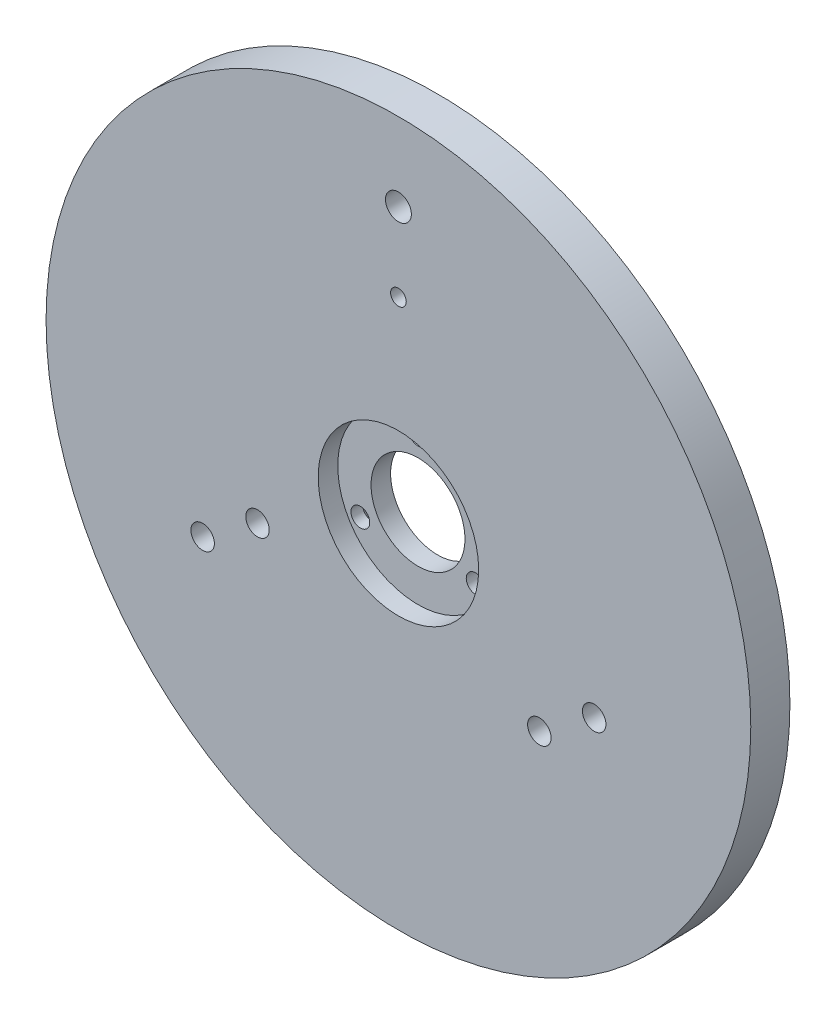
ISO-10303-21;
HEADER;
FILE_DESCRIPTION(('STEP AP214'),'2;1');
FILE_NAME('part.step','',(''),(''),'','','');
FILE_SCHEMA(('AUTOMOTIVE_DESIGN { 1 0 10303 214 1 1 1 1 }'));
ENDSEC;
DATA;
#1=APPLICATION_CONTEXT('core data for automotive mechanical design processes');
#2=APPLICATION_PROTOCOL_DEFINITION('international standard','automotive_design',2000,#1);
#3=PRODUCT_CONTEXT('',#1,'mechanical');
#4=PRODUCT('Part','Part','',(#3));
#5=PRODUCT_RELATED_PRODUCT_CATEGORY('part','',(#4));
#6=PRODUCT_DEFINITION_FORMATION('','',#4);
#7=PRODUCT_DEFINITION_CONTEXT('part definition',#1,'design');
#8=PRODUCT_DEFINITION('design','',#6,#7);
#9=PRODUCT_DEFINITION_SHAPE('','',#8);
#10=(LENGTH_UNIT() NAMED_UNIT(*) SI_UNIT(.MILLI.,.METRE.));
#11=(NAMED_UNIT(*) PLANE_ANGLE_UNIT() SI_UNIT($,.RADIAN.));
#12=(NAMED_UNIT(*) SI_UNIT($,.STERADIAN.) SOLID_ANGLE_UNIT());
#13=UNCERTAINTY_MEASURE_WITH_UNIT(LENGTH_MEASURE(1.E-05),#10,'distance_accuracy_value','');
#14=(GEOMETRIC_REPRESENTATION_CONTEXT(3) GLOBAL_UNCERTAINTY_ASSIGNED_CONTEXT((#13)) GLOBAL_UNIT_ASSIGNED_CONTEXT((#10,
#11,#12)) REPRESENTATION_CONTEXT('',''));
#15=CARTESIAN_POINT('',(0.,0.,0.));
#16=DIRECTION('',(0.,0.,1.));
#17=DIRECTION('',(1.,0.,0.));
#18=AXIS2_PLACEMENT_3D('',#15,#16,#17);
#19=CARTESIAN_POINT('',(-40.0000000000309,44.9999999999551,34.5));
#20=DIRECTION('',(0.,0.,1.));
#21=DIRECTION('',(1.,0.,0.));
#22=AXIS2_PLACEMENT_3D('',#19,#20,#21);
#23=CYLINDRICAL_SURFACE('',#22,45.00000000002);
#24=CARTESIAN_POINT('',(-40.0000000000309,44.9999999999551,34.5));
#25=DIRECTION('',(0.,0.,1.));
#26=DIRECTION('',(1.,0.,0.));
#27=AXIS2_PLACEMENT_3D('',#24,#25,#26);
#28=CIRCLE('',#27,45.00000000002);
#29=CARTESIAN_POINT('',(4.99999999998911,44.9999999999551,34.5));
#30=VERTEX_POINT('',#29);
#31=EDGE_CURVE('E10',#30,#30,#28,.T.);
#32=ORIENTED_EDGE('',*,*,#31,.T.);
#33=EDGE_LOOP('',(#32));
#34=FACE_BOUND('',#33,.T.);
#35=CARTESIAN_POINT('',(-40.0000000000309,44.9999999999551,39.5));
#36=DIRECTION('',(0.,0.,1.));
#37=DIRECTION('',(1.,0.,0.));
#38=AXIS2_PLACEMENT_3D('',#35,#36,#37);
#39=CIRCLE('',#38,45.00000000002);
#40=CARTESIAN_POINT('',(4.99999999998911,44.9999999999551,39.5));
#41=VERTEX_POINT('',#40);
#42=EDGE_CURVE('E39',#41,#41,#39,.T.);
#43=ORIENTED_EDGE('',*,*,#42,.F.);
#44=EDGE_LOOP('',(#43));
#45=FACE_BOUND('',#44,.T.);
#46=ADVANCED_FACE('F32',(#34,#45),#23,.T.);
#47=CARTESIAN_POINT('',(-40.0000000000309,44.9999999999551,34.5));
#48=DIRECTION('',(0.,0.,1.));
#49=DIRECTION('',(1.,0.,0.));
#50=AXIS2_PLACEMENT_3D('',#47,#48,#49);
#51=PLANE('',#50);
#52=CARTESIAN_POINT('',(-40.,70.,34.5));
#53=DIRECTION('',(0.,0.,1.));
#54=DIRECTION('',(1.,0.,0.));
#55=AXIS2_PLACEMENT_3D('',#52,#53,#54);
#56=CIRCLE('',#55,0.999999999999985);
#57=CARTESIAN_POINT('',(-39.,70.,34.5));
#58=VERTEX_POINT('',#57);
#59=EDGE_CURVE('E299',#58,#58,#56,.T.);
#60=ORIENTED_EDGE('',*,*,#59,.T.);
#61=EDGE_LOOP('',(#60));
#62=FACE_BOUND('',#61,.T.);
#63=CARTESIAN_POINT('',(-21.9999999999903,31.,34.5));
#64=DIRECTION('',(0.,0.,1.));
#65=DIRECTION('',(1.,0.,0.));
#66=AXIS2_PLACEMENT_3D('',#63,#64,#65);
#67=CIRCLE('',#66,1.5);
#68=CARTESIAN_POINT('',(-20.4999999999903,31.,34.5));
#69=VERTEX_POINT('',#68);
#70=EDGE_CURVE('E303',#69,#69,#67,.T.);
#71=ORIENTED_EDGE('',*,*,#70,.T.);
#72=EDGE_LOOP('',(#71));
#73=FACE_BOUND('',#72,.T.);
#74=CARTESIAN_POINT('',(-14.9999999999903,36.,34.5));
#75=DIRECTION('',(0.,0.,1.));
#76=DIRECTION('',(1.,0.,0.));
#77=AXIS2_PLACEMENT_3D('',#74,#75,#76);
#78=CIRCLE('',#77,1.5);
#79=CARTESIAN_POINT('',(-13.4999999999903,36.,34.5));
#80=VERTEX_POINT('',#79);
#81=EDGE_CURVE('E307',#80,#80,#78,.T.);
#82=ORIENTED_EDGE('',*,*,#81,.T.);
#83=EDGE_LOOP('',(#82));
#84=FACE_BOUND('',#83,.T.);
#85=CARTESIAN_POINT('',(-65.0000000000097,31.,34.5));
#86=DIRECTION('',(0.,0.,1.));
#87=DIRECTION('',(1.,0.,0.));
#88=AXIS2_PLACEMENT_3D('',#85,#86,#87);
#89=CIRCLE('',#88,1.5);
#90=CARTESIAN_POINT('',(-63.5000000000097,31.,34.5));
#91=VERTEX_POINT('',#90);
#92=EDGE_CURVE('E311',#91,#91,#89,.T.);
#93=ORIENTED_EDGE('',*,*,#92,.T.);
#94=EDGE_LOOP('',(#93));
#95=FACE_BOUND('',#94,.T.);
#96=CARTESIAN_POINT('',(-58.0000000000097,36.,34.5));
#97=DIRECTION('',(0.,0.,1.));
#98=DIRECTION('',(1.,0.,0.));
#99=AXIS2_PLACEMENT_3D('',#96,#97,#98);
#100=CIRCLE('',#99,1.5);
#101=CARTESIAN_POINT('',(-56.5000000000097,36.,34.5));
#102=VERTEX_POINT('',#101);
#103=EDGE_CURVE('E139',#102,#102,#100,.T.);
#104=ORIENTED_EDGE('',*,*,#103,.T.);
#105=EDGE_LOOP('',(#104));
#106=FACE_BOUND('',#105,.T.);
#107=CARTESIAN_POINT('',(-40.,80.,34.5));
#108=DIRECTION('',(0.,0.,1.));
#109=DIRECTION('',(1.,0.,0.));
#110=AXIS2_PLACEMENT_3D('',#107,#108,#109);
#111=CIRCLE('',#110,1.65);
#112=CARTESIAN_POINT('',(-38.35,80.,34.5));
#113=VERTEX_POINT('',#112);
#114=EDGE_CURVE('E138',#113,#113,#111,.T.);
#115=ORIENTED_EDGE('',*,*,#114,.T.);
#116=EDGE_LOOP('',(#115));
#117=FACE_BOUND('',#116,.T.);
#118=CARTESIAN_POINT('',(-40.0000000000309,53.499999999953,34.5));
#119=DIRECTION('',(0.,0.,-1.));
#120=DIRECTION('',(-1.,0.,0.));
#121=AXIS2_PLACEMENT_3D('',#118,#119,#120);
#122=CIRCLE('',#121,2.2);
#123=CARTESIAN_POINT('',(-42.2000000000309,53.499999999953,34.5));
#124=VERTEX_POINT('',#123);
#125=EDGE_CURVE('E142',#124,#124,#122,.T.);
#126=ORIENTED_EDGE('',*,*,#125,.F.);
#127=EDGE_LOOP('',(#126));
#128=FACE_BOUND('',#127,.T.);
#129=CARTESIAN_POINT('',(-32.638784067865,40.7499999999561,34.5));
#130=DIRECTION('',(0.,0.,-1.));
#131=DIRECTION('',(-1.,0.,0.));
#132=AXIS2_PLACEMENT_3D('',#129,#130,#131);
#133=CIRCLE('',#132,2.2);
#134=CARTESIAN_POINT('',(-34.838784067865,40.7499999999561,34.5));
#135=VERTEX_POINT('',#134);
#136=EDGE_CURVE('E66',#135,#135,#133,.T.);
#137=ORIENTED_EDGE('',*,*,#136,.F.);
#138=EDGE_LOOP('',(#137));
#139=FACE_BOUND('',#138,.T.);
#140=CARTESIAN_POINT('',(-47.3612159321968,40.7499999999561,34.5));
#141=DIRECTION('',(0.,0.,-1.));
#142=DIRECTION('',(-1.,0.,0.));
#143=AXIS2_PLACEMENT_3D('',#140,#141,#142);
#144=CIRCLE('',#143,2.2);
#145=CARTESIAN_POINT('',(-49.5612159321968,40.7499999999561,34.5));
#146=VERTEX_POINT('',#145);
#147=EDGE_CURVE('E59',#146,#146,#144,.T.);
#148=ORIENTED_EDGE('',*,*,#147,.F.);
#149=EDGE_LOOP('',(#148));
#150=FACE_BOUND('',#149,.T.);
#151=CARTESIAN_POINT('',(-40.0000000000309,44.9999999999551,34.5));
#152=DIRECTION('',(0.,0.,1.));
#153=DIRECTION('',(1.,0.,0.));
#154=AXIS2_PLACEMENT_3D('',#151,#152,#153);
#155=CIRCLE('',#154,6.);
#156=CARTESIAN_POINT('',(-34.0000000000309,44.9999999999551,34.5));
#157=VERTEX_POINT('',#156);
#158=EDGE_CURVE('E53',#157,#157,#155,.T.);
#159=ORIENTED_EDGE('',*,*,#158,.T.);
#160=EDGE_LOOP('',(#159));
#161=FACE_BOUND('',#160,.T.);
#162=ORIENTED_EDGE('',*,*,#31,.F.);
#163=EDGE_LOOP('',(#162));
#164=FACE_BOUND('',#163,.T.);
#165=ADVANCED_FACE('F100',(#62,#73,#84,#95,#106,#117,#128,#139,#150,#161,#164),#51,.F.);
#166=CARTESIAN_POINT('',(-40.0000000000309,44.9999999999551,39.5));
#167=DIRECTION('',(0.,0.,1.));
#168=DIRECTION('',(1.,0.,0.));
#169=AXIS2_PLACEMENT_3D('',#166,#167,#168);
#170=PLANE('',#169);
#171=CARTESIAN_POINT('',(-40.,70.,39.5));
#172=DIRECTION('',(0.,0.,1.));
#173=DIRECTION('',(1.,0.,0.));
#174=AXIS2_PLACEMENT_3D('',#171,#172,#173);
#175=CIRCLE('',#174,0.999999999999985);
#176=CARTESIAN_POINT('',(-39.,70.,39.5));
#177=VERTEX_POINT('',#176);
#178=EDGE_CURVE('E116',#177,#177,#175,.T.);
#179=ORIENTED_EDGE('',*,*,#178,.F.);
#180=EDGE_LOOP('',(#179));
#181=FACE_BOUND('',#180,.T.);
#182=CARTESIAN_POINT('',(-21.9999999999903,31.,39.5));
#183=DIRECTION('',(0.,0.,1.));
#184=DIRECTION('',(1.,0.,0.));
#185=AXIS2_PLACEMENT_3D('',#182,#183,#184);
#186=CIRCLE('',#185,1.5);
#187=CARTESIAN_POINT('',(-20.4999999999903,31.,39.5));
#188=VERTEX_POINT('',#187);
#189=EDGE_CURVE('E120',#188,#188,#186,.T.);
#190=ORIENTED_EDGE('',*,*,#189,.F.);
#191=EDGE_LOOP('',(#190));
#192=FACE_BOUND('',#191,.T.);
#193=CARTESIAN_POINT('',(-14.9999999999903,36.,39.5));
#194=DIRECTION('',(0.,0.,1.));
#195=DIRECTION('',(1.,0.,0.));
#196=AXIS2_PLACEMENT_3D('',#193,#194,#195);
#197=CIRCLE('',#196,1.5);
#198=CARTESIAN_POINT('',(-13.4999999999903,36.,39.5));
#199=VERTEX_POINT('',#198);
#200=EDGE_CURVE('E124',#199,#199,#197,.T.);
#201=ORIENTED_EDGE('',*,*,#200,.F.);
#202=EDGE_LOOP('',(#201));
#203=FACE_BOUND('',#202,.T.);
#204=CARTESIAN_POINT('',(-65.0000000000097,31.,39.5));
#205=DIRECTION('',(0.,0.,1.));
#206=DIRECTION('',(1.,0.,0.));
#207=AXIS2_PLACEMENT_3D('',#204,#205,#206);
#208=CIRCLE('',#207,1.5);
#209=CARTESIAN_POINT('',(-63.5000000000097,31.,39.5));
#210=VERTEX_POINT('',#209);
#211=EDGE_CURVE('E128',#210,#210,#208,.T.);
#212=ORIENTED_EDGE('',*,*,#211,.F.);
#213=EDGE_LOOP('',(#212));
#214=FACE_BOUND('',#213,.T.);
#215=CARTESIAN_POINT('',(-58.0000000000097,36.,39.5));
#216=DIRECTION('',(0.,0.,1.));
#217=DIRECTION('',(1.,0.,0.));
#218=AXIS2_PLACEMENT_3D('',#215,#216,#217);
#219=CIRCLE('',#218,1.5);
#220=CARTESIAN_POINT('',(-56.5000000000097,36.,39.5));
#221=VERTEX_POINT('',#220);
#222=EDGE_CURVE('E132',#221,#221,#219,.T.);
#223=ORIENTED_EDGE('',*,*,#222,.F.);
#224=EDGE_LOOP('',(#223));
#225=FACE_BOUND('',#224,.T.);
#226=CARTESIAN_POINT('',(-40.,80.,39.5));
#227=DIRECTION('',(0.,0.,1.));
#228=DIRECTION('',(1.,0.,0.));
#229=AXIS2_PLACEMENT_3D('',#226,#227,#228);
#230=CIRCLE('',#229,1.65);
#231=CARTESIAN_POINT('',(-38.35,80.,39.5));
#232=VERTEX_POINT('',#231);
#233=EDGE_CURVE('E136',#232,#232,#230,.T.);
#234=ORIENTED_EDGE('',*,*,#233,.F.);
#235=EDGE_LOOP('',(#234));
#236=FACE_BOUND('',#235,.T.);
#237=CARTESIAN_POINT('',(-40.0000000000309,44.9999999999551,39.5));
#238=DIRECTION('',(0.,0.,1.));
#239=DIRECTION('',(1.,0.,0.));
#240=AXIS2_PLACEMENT_3D('',#237,#238,#239);
#241=CIRCLE('',#240,10.25);
#242=CARTESIAN_POINT('',(-29.7500000000309,44.9999999999551,39.5));
#243=VERTEX_POINT('',#242);
#244=EDGE_CURVE('E52',#243,#243,#241,.T.);
#245=ORIENTED_EDGE('',*,*,#244,.F.);
#246=EDGE_LOOP('',(#245));
#247=FACE_BOUND('',#246,.T.);
#248=ORIENTED_EDGE('',*,*,#42,.T.);
#249=EDGE_LOOP('',(#248));
#250=FACE_BOUND('',#249,.T.);
#251=ADVANCED_FACE('F96',(#181,#192,#203,#214,#225,#236,#247,#250),#170,.T.);
#252=CARTESIAN_POINT('',(-40.0000000000309,44.9999999999551,37.));
#253=DIRECTION('',(0.,0.,-1.));
#254=DIRECTION('',(-1.,0.,0.));
#255=AXIS2_PLACEMENT_3D('',#252,#253,#254);
#256=PLANE('',#255);
#257=CARTESIAN_POINT('',(-40.0000000000309,53.499999999953,37.));
#258=DIRECTION('',(0.,0.,-1.));
#259=DIRECTION('',(-1.,0.,0.));
#260=AXIS2_PLACEMENT_3D('',#257,#258,#259);
#261=CIRCLE('',#260,1.19999999999999);
#262=CARTESIAN_POINT('',(-41.2000000000309,53.499999999953,37.));
#263=VERTEX_POINT('',#262);
#264=EDGE_CURVE('E35',#263,#263,#261,.T.);
#265=ORIENTED_EDGE('',*,*,#264,.T.);
#266=EDGE_LOOP('',(#265));
#267=FACE_BOUND('',#266,.T.);
#268=CARTESIAN_POINT('',(-32.638784067865,40.7499999999561,37.));
#269=DIRECTION('',(0.,0.,-1.));
#270=DIRECTION('',(-1.,0.,0.));
#271=AXIS2_PLACEMENT_3D('',#268,#269,#270);
#272=CIRCLE('',#271,1.19999999999999);
#273=CARTESIAN_POINT('',(-33.838784067865,40.7499999999561,37.));
#274=VERTEX_POINT('',#273);
#275=EDGE_CURVE('E57',#274,#274,#272,.T.);
#276=ORIENTED_EDGE('',*,*,#275,.T.);
#277=EDGE_LOOP('',(#276));
#278=FACE_BOUND('',#277,.T.);
#279=CARTESIAN_POINT('',(-47.3612159321968,40.7499999999561,37.));
#280=DIRECTION('',(0.,0.,-1.));
#281=DIRECTION('',(-1.,0.,0.));
#282=AXIS2_PLACEMENT_3D('',#279,#280,#281);
#283=CIRCLE('',#282,1.19999999999999);
#284=CARTESIAN_POINT('',(-48.5612159321968,40.7499999999561,37.));
#285=VERTEX_POINT('',#284);
#286=EDGE_CURVE('E54',#285,#285,#283,.T.);
#287=ORIENTED_EDGE('',*,*,#286,.T.);
#288=EDGE_LOOP('',(#287));
#289=FACE_BOUND('',#288,.T.);
#290=CARTESIAN_POINT('',(-40.0000000000309,44.9999999999551,37.));
#291=DIRECTION('',(0.,0.,-1.));
#292=DIRECTION('',(-1.,0.,0.));
#293=AXIS2_PLACEMENT_3D('',#290,#291,#292);
#294=CIRCLE('',#293,6.);
#295=CARTESIAN_POINT('',(-46.0000000000309,44.9999999999551,37.));
#296=VERTEX_POINT('',#295);
#297=EDGE_CURVE('E49',#296,#296,#294,.T.);
#298=ORIENTED_EDGE('',*,*,#297,.T.);
#299=EDGE_LOOP('',(#298));
#300=FACE_BOUND('',#299,.T.);
#301=CARTESIAN_POINT('',(-40.0000000000309,44.9999999999551,37.));
#302=DIRECTION('',(0.,0.,1.));
#303=DIRECTION('',(1.,0.,0.));
#304=AXIS2_PLACEMENT_3D('',#301,#302,#303);
#305=CIRCLE('',#304,10.25);
#306=CARTESIAN_POINT('',(-29.7500000000309,44.9999999999551,37.));
#307=VERTEX_POINT('',#306);
#308=EDGE_CURVE('E44',#307,#307,#305,.T.);
#309=ORIENTED_EDGE('',*,*,#308,.T.);
#310=EDGE_LOOP('',(#309));
#311=FACE_BOUND('',#310,.T.);
#312=ADVANCED_FACE('F83',(#267,#278,#289,#300,#311),#256,.F.);
#313=CARTESIAN_POINT('',(-40.0000000000309,44.9999999999551,39.5));
#314=DIRECTION('',(0.,0.,1.));
#315=DIRECTION('',(1.,0.,0.));
#316=AXIS2_PLACEMENT_3D('',#313,#314,#315);
#317=CYLINDRICAL_SURFACE('',#316,10.25);
#318=ORIENTED_EDGE('',*,*,#308,.F.);
#319=EDGE_LOOP('',(#318));
#320=FACE_BOUND('',#319,.T.);
#321=ORIENTED_EDGE('',*,*,#244,.T.);
#322=EDGE_LOOP('',(#321));
#323=FACE_BOUND('',#322,.T.);
#324=ADVANCED_FACE('F85',(#320,#323),#317,.F.);
#325=CARTESIAN_POINT('',(-40.0000000000309,44.9999999999551,39.5));
#326=DIRECTION('',(0.,0.,1.));
#327=DIRECTION('',(1.,0.,0.));
#328=AXIS2_PLACEMENT_3D('',#325,#326,#327);
#329=CYLINDRICAL_SURFACE('',#328,6.);
#330=ORIENTED_EDGE('',*,*,#158,.F.);
#331=EDGE_LOOP('',(#330));
#332=FACE_BOUND('',#331,.T.);
#333=ORIENTED_EDGE('',*,*,#297,.F.);
#334=EDGE_LOOP('',(#333));
#335=FACE_BOUND('',#334,.T.);
#336=ADVANCED_FACE('F87',(#332,#335),#329,.F.);
#337=CARTESIAN_POINT('',(-47.3612159321968,40.7499999999561,34.5));
#338=DIRECTION('',(0.,0.,-1.));
#339=DIRECTION('',(-1.,0.,0.));
#340=AXIS2_PLACEMENT_3D('',#337,#338,#339);
#341=CYLINDRICAL_SURFACE('',#340,1.19999999999999);
#342=CARTESIAN_POINT('',(-47.3612159321968,40.7499999999561,35.5));
#343=DIRECTION('',(0.,0.,-1.));
#344=DIRECTION('',(-1.,0.,0.));
#345=AXIS2_PLACEMENT_3D('',#342,#343,#344);
#346=CIRCLE('',#345,1.2);
#347=CARTESIAN_POINT('',(-48.5612159321968,40.7499999999561,35.5));
#348=VERTEX_POINT('',#347);
#349=EDGE_CURVE('E56',#348,#348,#346,.T.);
#350=ORIENTED_EDGE('',*,*,#349,.T.);
#351=EDGE_LOOP('',(#350));
#352=FACE_BOUND('',#351,.T.);
#353=ORIENTED_EDGE('',*,*,#286,.F.);
#354=EDGE_LOOP('',(#353));
#355=FACE_BOUND('',#354,.T.);
#356=ADVANCED_FACE('F93',(#352,#355),#341,.F.);
#357=CARTESIAN_POINT('',(-47.3612159321968,40.7499999999561,34.5));
#358=DIRECTION('',(0.,0.,-1.));
#359=DIRECTION('',(-1.,0.,0.));
#360=AXIS2_PLACEMENT_3D('',#357,#358,#359);
#361=CONICAL_SURFACE('',#360,2.2,0.785398163397448);
#362=ORIENTED_EDGE('',*,*,#349,.F.);
#363=EDGE_LOOP('',(#362));
#364=FACE_BOUND('',#363,.T.);
#365=ORIENTED_EDGE('',*,*,#147,.T.);
#366=EDGE_LOOP('',(#365));
#367=FACE_BOUND('',#366,.T.);
#368=ADVANCED_FACE('F175',(#364,#367),#361,.F.);
#369=CARTESIAN_POINT('',(-32.638784067865,40.7499999999561,34.5));
#370=DIRECTION('',(0.,0.,-1.));
#371=DIRECTION('',(-1.,0.,0.));
#372=AXIS2_PLACEMENT_3D('',#369,#370,#371);
#373=CYLINDRICAL_SURFACE('',#372,1.19999999999999);
#374=CARTESIAN_POINT('',(-32.638784067865,40.7499999999561,35.5));
#375=DIRECTION('',(0.,0.,-1.));
#376=DIRECTION('',(-1.,0.,0.));
#377=AXIS2_PLACEMENT_3D('',#374,#375,#376);
#378=CIRCLE('',#377,1.2);
#379=CARTESIAN_POINT('',(-33.838784067865,40.7499999999561,35.5));
#380=VERTEX_POINT('',#379);
#381=EDGE_CURVE('E60',#380,#380,#378,.T.);
#382=ORIENTED_EDGE('',*,*,#381,.T.);
#383=EDGE_LOOP('',(#382));
#384=FACE_BOUND('',#383,.T.);
#385=ORIENTED_EDGE('',*,*,#275,.F.);
#386=EDGE_LOOP('',(#385));
#387=FACE_BOUND('',#386,.T.);
#388=ADVANCED_FACE('F168',(#384,#387),#373,.F.);
#389=CARTESIAN_POINT('',(-32.638784067865,40.7499999999561,34.5));
#390=DIRECTION('',(0.,0.,-1.));
#391=DIRECTION('',(-1.,0.,0.));
#392=AXIS2_PLACEMENT_3D('',#389,#390,#391);
#393=CONICAL_SURFACE('',#392,2.2,0.785398163397448);
#394=ORIENTED_EDGE('',*,*,#381,.F.);
#395=EDGE_LOOP('',(#394));
#396=FACE_BOUND('',#395,.T.);
#397=ORIENTED_EDGE('',*,*,#136,.T.);
#398=EDGE_LOOP('',(#397));
#399=FACE_BOUND('',#398,.T.);
#400=ADVANCED_FACE('F159',(#396,#399),#393,.F.);
#401=CARTESIAN_POINT('',(-40.0000000000309,53.499999999953,34.5));
#402=DIRECTION('',(0.,0.,-1.));
#403=DIRECTION('',(-1.,0.,0.));
#404=AXIS2_PLACEMENT_3D('',#401,#402,#403);
#405=CYLINDRICAL_SURFACE('',#404,1.19999999999999);
#406=CARTESIAN_POINT('',(-40.0000000000309,53.499999999953,35.5));
#407=DIRECTION('',(0.,0.,-1.));
#408=DIRECTION('',(-1.,0.,0.));
#409=AXIS2_PLACEMENT_3D('',#406,#407,#408);
#410=CIRCLE('',#409,1.2);
#411=CARTESIAN_POINT('',(-41.2000000000309,53.499999999953,35.5));
#412=VERTEX_POINT('',#411);
#413=EDGE_CURVE('E149',#412,#412,#410,.T.);
#414=ORIENTED_EDGE('',*,*,#413,.T.);
#415=EDGE_LOOP('',(#414));
#416=FACE_BOUND('',#415,.T.);
#417=ORIENTED_EDGE('',*,*,#264,.F.);
#418=EDGE_LOOP('',(#417));
#419=FACE_BOUND('',#418,.T.);
#420=ADVANCED_FACE('F156',(#416,#419),#405,.F.);
#421=CARTESIAN_POINT('',(-40.0000000000309,53.499999999953,34.5));
#422=DIRECTION('',(0.,0.,-1.));
#423=DIRECTION('',(-1.,0.,0.));
#424=AXIS2_PLACEMENT_3D('',#421,#422,#423);
#425=CONICAL_SURFACE('',#424,2.2,0.785398163397448);
#426=ORIENTED_EDGE('',*,*,#413,.F.);
#427=EDGE_LOOP('',(#426));
#428=FACE_BOUND('',#427,.T.);
#429=ORIENTED_EDGE('',*,*,#125,.T.);
#430=EDGE_LOOP('',(#429));
#431=FACE_BOUND('',#430,.T.);
#432=ADVANCED_FACE('F158',(#428,#431),#425,.F.);
#433=CARTESIAN_POINT('',(-40.,80.,39.5));
#434=DIRECTION('',(0.,0.,1.));
#435=DIRECTION('',(1.,0.,0.));
#436=AXIS2_PLACEMENT_3D('',#433,#434,#435);
#437=CYLINDRICAL_SURFACE('',#436,1.65);
#438=ORIENTED_EDGE('',*,*,#114,.F.);
#439=EDGE_LOOP('',(#438));
#440=FACE_BOUND('',#439,.T.);
#441=ORIENTED_EDGE('',*,*,#233,.T.);
#442=EDGE_LOOP('',(#441));
#443=FACE_BOUND('',#442,.T.);
#444=ADVANCED_FACE('F165',(#440,#443),#437,.F.);
#445=CARTESIAN_POINT('',(-58.0000000000097,36.,34.5));
#446=DIRECTION('',(0.,0.,1.));
#447=DIRECTION('',(1.,0.,0.));
#448=AXIS2_PLACEMENT_3D('',#445,#446,#447);
#449=CYLINDRICAL_SURFACE('',#448,1.5);
#450=ORIENTED_EDGE('',*,*,#103,.F.);
#451=EDGE_LOOP('',(#450));
#452=FACE_BOUND('',#451,.T.);
#453=ORIENTED_EDGE('',*,*,#222,.T.);
#454=EDGE_LOOP('',(#453));
#455=FACE_BOUND('',#454,.T.);
#456=ADVANCED_FACE('F231',(#452,#455),#449,.F.);
#457=CARTESIAN_POINT('',(-65.0000000000097,31.,34.5));
#458=DIRECTION('',(0.,0.,1.));
#459=DIRECTION('',(1.,0.,0.));
#460=AXIS2_PLACEMENT_3D('',#457,#458,#459);
#461=CYLINDRICAL_SURFACE('',#460,1.5);
#462=ORIENTED_EDGE('',*,*,#92,.F.);
#463=EDGE_LOOP('',(#462));
#464=FACE_BOUND('',#463,.T.);
#465=ORIENTED_EDGE('',*,*,#211,.T.);
#466=EDGE_LOOP('',(#465));
#467=FACE_BOUND('',#466,.T.);
#468=ADVANCED_FACE('F240',(#464,#467),#461,.F.);
#469=CARTESIAN_POINT('',(-14.9999999999903,36.,34.5));
#470=DIRECTION('',(0.,0.,1.));
#471=DIRECTION('',(1.,0.,0.));
#472=AXIS2_PLACEMENT_3D('',#469,#470,#471);
#473=CYLINDRICAL_SURFACE('',#472,1.5);
#474=ORIENTED_EDGE('',*,*,#81,.F.);
#475=EDGE_LOOP('',(#474));
#476=FACE_BOUND('',#475,.T.);
#477=ORIENTED_EDGE('',*,*,#200,.T.);
#478=EDGE_LOOP('',(#477));
#479=FACE_BOUND('',#478,.T.);
#480=ADVANCED_FACE('F250',(#476,#479),#473,.F.);
#481=CARTESIAN_POINT('',(-21.9999999999903,31.,34.5));
#482=DIRECTION('',(0.,0.,1.));
#483=DIRECTION('',(1.,0.,0.));
#484=AXIS2_PLACEMENT_3D('',#481,#482,#483);
#485=CYLINDRICAL_SURFACE('',#484,1.5);
#486=ORIENTED_EDGE('',*,*,#70,.F.);
#487=EDGE_LOOP('',(#486));
#488=FACE_BOUND('',#487,.T.);
#489=ORIENTED_EDGE('',*,*,#189,.T.);
#490=EDGE_LOOP('',(#489));
#491=FACE_BOUND('',#490,.T.);
#492=ADVANCED_FACE('F260',(#488,#491),#485,.F.);
#493=CARTESIAN_POINT('',(-40.,70.,34.5));
#494=DIRECTION('',(0.,0.,1.));
#495=DIRECTION('',(1.,0.,0.));
#496=AXIS2_PLACEMENT_3D('',#493,#494,#495);
#497=CYLINDRICAL_SURFACE('',#496,0.999999999999985);
#498=ORIENTED_EDGE('',*,*,#59,.F.);
#499=EDGE_LOOP('',(#498));
#500=FACE_BOUND('',#499,.T.);
#501=ORIENTED_EDGE('',*,*,#178,.T.);
#502=EDGE_LOOP('',(#501));
#503=FACE_BOUND('',#502,.T.);
#504=ADVANCED_FACE('F270',(#500,#503),#497,.F.);
#505=CLOSED_SHELL('',(#46,#165,#251,#312,#324,#336,#356,#368,#388,#400,#420,#432,#444,#456,#468,
#480,#492,#504));
#506=MANIFOLD_SOLID_BREP('B2',#505);
#507=ADVANCED_BREP_SHAPE_REPRESENTATION('',(#18,#506),#14);
#508=SHAPE_DEFINITION_REPRESENTATION(#9,#507);
ENDSEC;
END-ISO-10303-21;
